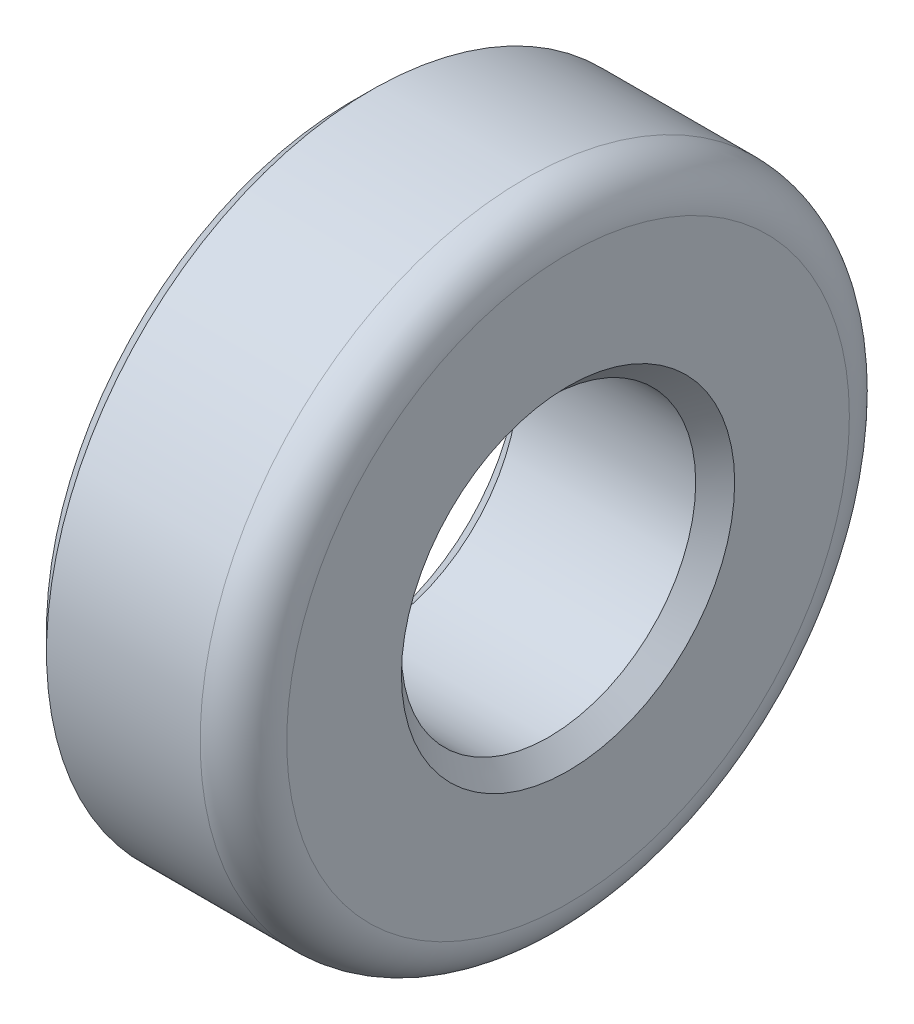
ISO-10303-21;
HEADER;
FILE_DESCRIPTION(('STEP AP214'),'2;1');
FILE_NAME('part.step','',(''),(''),'','','');
FILE_SCHEMA(('AUTOMOTIVE_DESIGN { 1 0 10303 214 1 1 1 1 }'));
ENDSEC;
DATA;
#1=APPLICATION_CONTEXT('core data for automotive mechanical design processes');
#2=APPLICATION_PROTOCOL_DEFINITION('international standard','automotive_design',2000,#1);
#3=PRODUCT_CONTEXT('',#1,'mechanical');
#4=PRODUCT('Part','Part','',(#3));
#5=PRODUCT_RELATED_PRODUCT_CATEGORY('part','',(#4));
#6=PRODUCT_DEFINITION_FORMATION('','',#4);
#7=PRODUCT_DEFINITION_CONTEXT('part definition',#1,'design');
#8=PRODUCT_DEFINITION('design','',#6,#7);
#9=PRODUCT_DEFINITION_SHAPE('','',#8);
#10=(LENGTH_UNIT() NAMED_UNIT(*) SI_UNIT(.MILLI.,.METRE.));
#11=(NAMED_UNIT(*) PLANE_ANGLE_UNIT() SI_UNIT($,.RADIAN.));
#12=(NAMED_UNIT(*) SI_UNIT($,.STERADIAN.) SOLID_ANGLE_UNIT());
#13=UNCERTAINTY_MEASURE_WITH_UNIT(LENGTH_MEASURE(1.E-05),#10,'distance_accuracy_value','');
#14=(GEOMETRIC_REPRESENTATION_CONTEXT(3) GLOBAL_UNCERTAINTY_ASSIGNED_CONTEXT((#13)) GLOBAL_UNIT_ASSIGNED_CONTEXT((#10,
#11,#12)) REPRESENTATION_CONTEXT('',''));
#15=CARTESIAN_POINT('',(0.,0.,0.));
#16=DIRECTION('',(0.,0.,1.));
#17=DIRECTION('',(1.,0.,0.));
#18=AXIS2_PLACEMENT_3D('',#15,#16,#17);
#19=CARTESIAN_POINT('',(-3.5,52.5596707782031,134.804015254503));
#20=DIRECTION('',(-1.,0.,0.));
#21=DIRECTION('',(0.,0.,1.));
#22=AXIS2_PLACEMENT_3D('',#19,#20,#21);
#23=CYLINDRICAL_SURFACE('',#22,3.75000000000033);
#24=CARTESIAN_POINT('',(-4.,52.5596707782031,134.804015254503));
#25=DIRECTION('',(1.,0.,0.));
#26=DIRECTION('',(0.,0.,-1.));
#27=AXIS2_PLACEMENT_3D('',#24,#25,#26);
#28=CIRCLE('',#27,3.75000000000033);
#29=CARTESIAN_POINT('',(-4.,52.5596707782031,131.054015254503));
#30=VERTEX_POINT('',#29);
#31=EDGE_CURVE('E10',#30,#30,#28,.F.);
#32=ORIENTED_EDGE('',*,*,#31,.T.);
#33=EDGE_LOOP('',(#32));
#34=FACE_BOUND('',#33,.T.);
#35=CARTESIAN_POINT('',(-5.77499999999999,52.5596707782031,134.804015254503));
#36=DIRECTION('',(1.,0.,0.));
#37=DIRECTION('',(0.,0.,-1.));
#38=AXIS2_PLACEMENT_3D('',#35,#36,#37);
#39=CIRCLE('',#38,3.75000000000033);
#40=CARTESIAN_POINT('',(-5.77499999999999,52.5596707782031,131.054015254503));
#41=VERTEX_POINT('',#40);
#42=EDGE_CURVE('E64',#41,#41,#39,.T.);
#43=ORIENTED_EDGE('',*,*,#42,.T.);
#44=EDGE_LOOP('',(#43));
#45=FACE_BOUND('',#44,.T.);
#46=ADVANCED_FACE('F35',(#34,#45),#23,.T.);
#47=CARTESIAN_POINT('',(-3.5,52.5596707782031,134.804015254503));
#48=DIRECTION('',(1.,0.,0.));
#49=DIRECTION('',(0.,0.,-1.));
#50=AXIS2_PLACEMENT_3D('',#47,#48,#49);
#51=PLANE('',#50);
#52=CARTESIAN_POINT('',(-3.5,52.5596707782031,134.804015254503));
#53=DIRECTION('',(1.,0.,0.));
#54=DIRECTION('',(0.,0.,-1.));
#55=AXIS2_PLACEMENT_3D('',#52,#53,#54);
#56=CIRCLE('',#55,3.25000000000033);
#57=CARTESIAN_POINT('',(-3.5,52.5596707782031,131.554015254503));
#58=VERTEX_POINT('',#57);
#59=EDGE_CURVE('E42',#58,#58,#56,.T.);
#60=ORIENTED_EDGE('',*,*,#59,.T.);
#61=EDGE_LOOP('',(#60));
#62=FACE_BOUND('',#61,.T.);
#63=CARTESIAN_POINT('',(-3.5,52.5596707782031,134.804015254503));
#64=DIRECTION('',(1.,0.,0.));
#65=DIRECTION('',(0.,0.,-1.));
#66=AXIS2_PLACEMENT_3D('',#63,#64,#65);
#67=CIRCLE('',#66,1.92500000000001);
#68=CARTESIAN_POINT('',(-3.5,52.5596707782031,132.879015254503));
#69=VERTEX_POINT('',#68);
#70=EDGE_CURVE('E55',#69,#69,#67,.F.);
#71=ORIENTED_EDGE('',*,*,#70,.T.);
#72=EDGE_LOOP('',(#71));
#73=FACE_BOUND('',#72,.T.);
#74=ADVANCED_FACE('F89',(#62,#73),#51,.T.);
#75=CARTESIAN_POINT('',(-6.,52.5596707782031,134.804015254503));
#76=DIRECTION('',(1.,0.,0.));
#77=DIRECTION('',(0.,0.,-1.));
#78=AXIS2_PLACEMENT_3D('',#75,#76,#77);
#79=PLANE('',#78);
#80=CARTESIAN_POINT('',(-6.,52.5596707782031,134.804015254503));
#81=DIRECTION('',(1.,0.,0.));
#82=DIRECTION('',(0.,0.,-1.));
#83=AXIS2_PLACEMENT_3D('',#80,#81,#82);
#84=CIRCLE('',#83,3.52500000000033);
#85=CARTESIAN_POINT('',(-6.,52.5596707782031,131.279015254503));
#86=VERTEX_POINT('',#85);
#87=EDGE_CURVE('E58',#86,#86,#84,.F.);
#88=ORIENTED_EDGE('',*,*,#87,.T.);
#89=EDGE_LOOP('',(#88));
#90=FACE_BOUND('',#89,.T.);
#91=CARTESIAN_POINT('',(-6.,52.5596707782031,134.804015254503));
#92=DIRECTION('',(1.,0.,0.));
#93=DIRECTION('',(0.,0.,-1.));
#94=AXIS2_PLACEMENT_3D('',#91,#92,#93);
#95=CIRCLE('',#94,1.92500000000001);
#96=CARTESIAN_POINT('',(-6.,52.5596707782031,132.879015254503));
#97=VERTEX_POINT('',#96);
#98=EDGE_CURVE('E61',#97,#97,#95,.T.);
#99=ORIENTED_EDGE('',*,*,#98,.T.);
#100=EDGE_LOOP('',(#99));
#101=FACE_BOUND('',#100,.T.);
#102=ADVANCED_FACE('F82',(#90,#101),#79,.F.);
#103=CARTESIAN_POINT('',(-6.,52.5596707782031,134.804015254503));
#104=DIRECTION('',(-1.,0.,0.));
#105=DIRECTION('',(0.,0.,1.));
#106=AXIS2_PLACEMENT_3D('',#103,#104,#105);
#107=CYLINDRICAL_SURFACE('',#106,1.7);
#108=CARTESIAN_POINT('',(-3.72500000000002,52.5596707782031,134.804015254503));
#109=DIRECTION('',(1.,0.,0.));
#110=DIRECTION('',(0.,0.,-1.));
#111=AXIS2_PLACEMENT_3D('',#108,#109,#110);
#112=CIRCLE('',#111,1.7);
#113=CARTESIAN_POINT('',(-3.72500000000002,52.5596707782031,133.104015254503));
#114=VERTEX_POINT('',#113);
#115=EDGE_CURVE('E46',#114,#114,#112,.T.);
#116=ORIENTED_EDGE('',*,*,#115,.T.);
#117=EDGE_LOOP('',(#116));
#118=FACE_BOUND('',#117,.T.);
#119=CARTESIAN_POINT('',(-5.77499999999998,52.5596707782031,134.804015254503));
#120=DIRECTION('',(1.,0.,0.));
#121=DIRECTION('',(0.,0.,-1.));
#122=AXIS2_PLACEMENT_3D('',#119,#120,#121);
#123=CIRCLE('',#122,1.7);
#124=CARTESIAN_POINT('',(-5.77499999999998,52.5596707782031,133.104015254503));
#125=VERTEX_POINT('',#124);
#126=EDGE_CURVE('E50',#125,#125,#123,.F.);
#127=ORIENTED_EDGE('',*,*,#126,.T.);
#128=EDGE_LOOP('',(#127));
#129=FACE_BOUND('',#128,.T.);
#130=ADVANCED_FACE('F72',(#118,#129),#107,.F.);
#131=CARTESIAN_POINT('',(-5.77499999999999,52.5596707782031,134.804015254503));
#132=DIRECTION('',(1.,0.,0.));
#133=DIRECTION('',(0.,0.,-1.));
#134=AXIS2_PLACEMENT_3D('',#131,#132,#133);
#135=CONICAL_SURFACE('',#134,3.75000000000033,0.785398163397415);
#136=ORIENTED_EDGE('',*,*,#87,.F.);
#137=EDGE_LOOP('',(#136));
#138=FACE_BOUND('',#137,.T.);
#139=ORIENTED_EDGE('',*,*,#42,.F.);
#140=EDGE_LOOP('',(#139));
#141=FACE_BOUND('',#140,.T.);
#142=ADVANCED_FACE('F69',(#138,#141),#135,.T.);
#143=CARTESIAN_POINT('',(-3.5,52.5596707782031,134.804015254503));
#144=DIRECTION('',(1.,0.,0.));
#145=DIRECTION('',(0.,0.,-1.));
#146=AXIS2_PLACEMENT_3D('',#143,#144,#145);
#147=CONICAL_SURFACE('',#146,1.92500000000001,0.785398163397435);
#148=ORIENTED_EDGE('',*,*,#115,.F.);
#149=EDGE_LOOP('',(#148));
#150=FACE_BOUND('',#149,.T.);
#151=ORIENTED_EDGE('',*,*,#70,.F.);
#152=EDGE_LOOP('',(#151));
#153=FACE_BOUND('',#152,.T.);
#154=ADVANCED_FACE('F71',(#150,#153),#147,.F.);
#155=CARTESIAN_POINT('',(-5.77499999999998,52.5596707782031,134.804015254503));
#156=DIRECTION('',(-1.,0.,0.));
#157=DIRECTION('',(0.,0.,1.));
#158=AXIS2_PLACEMENT_3D('',#155,#156,#157);
#159=CONICAL_SURFACE('',#158,1.7,0.785398163397421);
#160=ORIENTED_EDGE('',*,*,#98,.F.);
#161=EDGE_LOOP('',(#160));
#162=FACE_BOUND('',#161,.T.);
#163=ORIENTED_EDGE('',*,*,#126,.F.);
#164=EDGE_LOOP('',(#163));
#165=FACE_BOUND('',#164,.T.);
#166=ADVANCED_FACE('F79',(#162,#165),#159,.F.);
#167=CARTESIAN_POINT('',(-4.,52.5596707782031,134.804015254503));
#168=DIRECTION('',(1.,0.,0.));
#169=DIRECTION('',(0.,0.,-1.));
#170=AXIS2_PLACEMENT_3D('',#167,#168,#169);
#171=TOROIDAL_SURFACE('',#170,3.25000000000033,0.5);
#172=ORIENTED_EDGE('',*,*,#31,.F.);
#173=EDGE_LOOP('',(#172));
#174=FACE_BOUND('',#173,.T.);
#175=ORIENTED_EDGE('',*,*,#59,.F.);
#176=EDGE_LOOP('',(#175));
#177=FACE_BOUND('',#176,.T.);
#178=ADVANCED_FACE('F37',(#174,#177),#171,.T.);
#179=CLOSED_SHELL('',(#46,#74,#102,#130,#142,#154,#166,#178));
#180=MANIFOLD_SOLID_BREP('B2',#179);
#181=ADVANCED_BREP_SHAPE_REPRESENTATION('',(#18,#180),#14);
#182=SHAPE_DEFINITION_REPRESENTATION(#9,#181);
ENDSEC;
END-ISO-10303-21;
